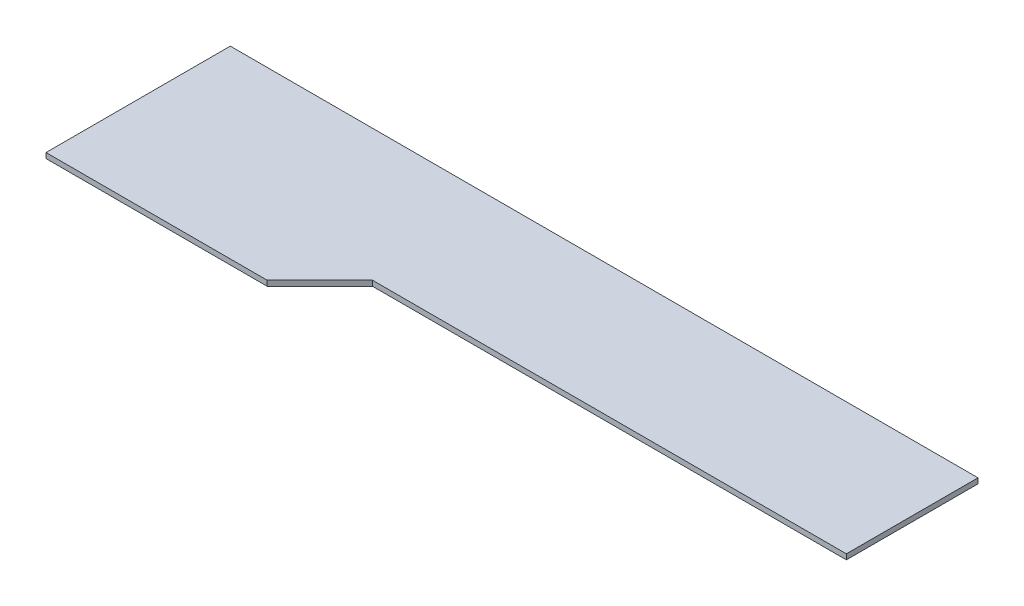
ISO-10303-21;
HEADER;
FILE_DESCRIPTION(('STEP AP214'),'2;1');
FILE_NAME('part.step','',(''),(''),'','','');
FILE_SCHEMA(('AUTOMOTIVE_DESIGN { 1 0 10303 214 1 1 1 1 }'));
ENDSEC;
DATA;
#1=APPLICATION_CONTEXT('core data for automotive mechanical design processes');
#2=APPLICATION_PROTOCOL_DEFINITION('international standard','automotive_design',2000,#1);
#3=PRODUCT_CONTEXT('',#1,'mechanical');
#4=PRODUCT('Part','Part','',(#3));
#5=PRODUCT_RELATED_PRODUCT_CATEGORY('part','',(#4));
#6=PRODUCT_DEFINITION_FORMATION('','',#4);
#7=PRODUCT_DEFINITION_CONTEXT('part definition',#1,'design');
#8=PRODUCT_DEFINITION('design','',#6,#7);
#9=PRODUCT_DEFINITION_SHAPE('','',#8);
#10=(LENGTH_UNIT() NAMED_UNIT(*) SI_UNIT(.MILLI.,.METRE.));
#11=(NAMED_UNIT(*) PLANE_ANGLE_UNIT() SI_UNIT($,.RADIAN.));
#12=(NAMED_UNIT(*) SI_UNIT($,.STERADIAN.) SOLID_ANGLE_UNIT());
#13=UNCERTAINTY_MEASURE_WITH_UNIT(LENGTH_MEASURE(1.E-05),#10,'distance_accuracy_value','');
#14=(GEOMETRIC_REPRESENTATION_CONTEXT(3) GLOBAL_UNCERTAINTY_ASSIGNED_CONTEXT((#13)) GLOBAL_UNIT_ASSIGNED_CONTEXT((#10,
#11,#12)) REPRESENTATION_CONTEXT('',''));
#15=CARTESIAN_POINT('',(0.,0.,0.));
#16=DIRECTION('',(0.,0.,1.));
#17=DIRECTION('',(1.,0.,0.));
#18=AXIS2_PLACEMENT_3D('',#15,#16,#17);
#19=CARTESIAN_POINT('',(0.,10.,100.));
#20=DIRECTION('',(0.,0.,-1.));
#21=DIRECTION('',(-1.,0.,0.));
#22=AXIS2_PLACEMENT_3D('',#19,#20,#21);
#23=PLANE('',#22);
#24=DIRECTION('',(1.,0.,0.));
#25=VECTOR('',#24,1.);
#26=CARTESIAN_POINT('',(0.,0.,100.));
#27=LINE('',#26,#25);
#28=CARTESIAN_POINT('',(0.,0.,100.));
#29=VERTEX_POINT('',#28);
#30=CARTESIAN_POINT('',(420.,0.,100.));
#31=VERTEX_POINT('',#30);
#32=EDGE_CURVE('E123',#29,#31,#27,.T.);
#33=ORIENTED_EDGE('',*,*,#32,.T.);
#34=DIRECTION('',(0.,-1.,0.));
#35=VECTOR('',#34,1.);
#36=CARTESIAN_POINT('',(420.,10.,100.));
#37=LINE('',#36,#35);
#38=CARTESIAN_POINT('',(420.,10.,100.));
#39=VERTEX_POINT('',#38);
#40=EDGE_CURVE('E43',#39,#31,#37,.T.);
#41=ORIENTED_EDGE('',*,*,#40,.F.);
#42=DIRECTION('',(1.,0.,0.));
#43=VECTOR('',#42,1.);
#44=CARTESIAN_POINT('',(0.,10.,100.));
#45=LINE('',#44,#43);
#46=CARTESIAN_POINT('',(0.,10.,100.));
#47=VERTEX_POINT('',#46);
#48=EDGE_CURVE('E89',#47,#39,#45,.T.);
#49=ORIENTED_EDGE('',*,*,#48,.F.);
#50=DIRECTION('',(0.,-1.,0.));
#51=VECTOR('',#50,1.);
#52=CARTESIAN_POINT('',(0.,10.,100.));
#53=LINE('',#52,#51);
#54=EDGE_CURVE('E11',#47,#29,#53,.T.);
#55=ORIENTED_EDGE('',*,*,#54,.T.);
#56=EDGE_LOOP('',(#33,#41,#49,#55));
#57=FACE_BOUND('',#56,.T.);
#58=ADVANCED_FACE('F35',(#57),#23,.F.);
#59=CARTESIAN_POINT('',(420.,10.,100.));
#60=DIRECTION('',(-0.707106781186549,0.,-0.707106781186546));
#61=DIRECTION('',(-0.707106781186546,0.,0.707106781186549));
#62=AXIS2_PLACEMENT_3D('',#59,#60,#61);
#63=PLANE('',#62);
#64=DIRECTION('',(0.707106781186546,0.,-0.707106781186549));
#65=VECTOR('',#64,1.);
#66=CARTESIAN_POINT('',(420.,0.,100.));
#67=LINE('',#66,#65);
#68=CARTESIAN_POINT('',(520.,0.,0.));
#69=VERTEX_POINT('',#68);
#70=EDGE_CURVE('E125',#31,#69,#67,.T.);
#71=ORIENTED_EDGE('',*,*,#70,.T.);
#72=DIRECTION('',(0.,-1.,0.));
#73=VECTOR('',#72,1.);
#74=CARTESIAN_POINT('',(520.,10.,0.));
#75=LINE('',#74,#73);
#76=CARTESIAN_POINT('',(520.,10.,0.));
#77=VERTEX_POINT('',#76);
#78=EDGE_CURVE('E112',#77,#69,#75,.T.);
#79=ORIENTED_EDGE('',*,*,#78,.F.);
#80=DIRECTION('',(0.707106781186546,0.,-0.707106781186549));
#81=VECTOR('',#80,1.);
#82=CARTESIAN_POINT('',(420.,10.,100.));
#83=LINE('',#82,#81);
#84=EDGE_CURVE('E103',#39,#77,#83,.T.);
#85=ORIENTED_EDGE('',*,*,#84,.F.);
#86=ORIENTED_EDGE('',*,*,#40,.T.);
#87=EDGE_LOOP('',(#71,#79,#85,#86));
#88=FACE_BOUND('',#87,.T.);
#89=ADVANCED_FACE('F137',(#88),#63,.F.);
#90=CARTESIAN_POINT('',(520.,10.,0.));
#91=DIRECTION('',(0.,0.,-1.));
#92=DIRECTION('',(-1.,0.,0.));
#93=AXIS2_PLACEMENT_3D('',#90,#91,#92);
#94=PLANE('',#93);
#95=DIRECTION('',(1.,0.,0.));
#96=VECTOR('',#95,1.);
#97=CARTESIAN_POINT('',(520.,0.,0.));
#98=LINE('',#97,#96);
#99=CARTESIAN_POINT('',(1420.,0.,0.));
#100=VERTEX_POINT('',#99);
#101=EDGE_CURVE('E111',#69,#100,#98,.T.);
#102=ORIENTED_EDGE('',*,*,#101,.T.);
#103=DIRECTION('',(0.,-1.,0.));
#104=VECTOR('',#103,1.);
#105=CARTESIAN_POINT('',(1420.,10.,0.));
#106=LINE('',#105,#104);
#107=CARTESIAN_POINT('',(1420.,10.,0.));
#108=VERTEX_POINT('',#107);
#109=EDGE_CURVE('E108',#108,#100,#106,.T.);
#110=ORIENTED_EDGE('',*,*,#109,.F.);
#111=DIRECTION('',(1.,0.,0.));
#112=VECTOR('',#111,1.);
#113=CARTESIAN_POINT('',(520.,10.,0.));
#114=LINE('',#113,#112);
#115=EDGE_CURVE('E97',#77,#108,#114,.T.);
#116=ORIENTED_EDGE('',*,*,#115,.F.);
#117=ORIENTED_EDGE('',*,*,#78,.T.);
#118=EDGE_LOOP('',(#102,#110,#116,#117));
#119=FACE_BOUND('',#118,.T.);
#120=ADVANCED_FACE('F109',(#119),#94,.F.);
#121=CARTESIAN_POINT('',(1420.,10.,0.));
#122=DIRECTION('',(-1.,0.,0.));
#123=DIRECTION('',(0.,0.,1.));
#124=AXIS2_PLACEMENT_3D('',#121,#122,#123);
#125=PLANE('',#124);
#126=DIRECTION('',(0.,0.,-1.));
#127=VECTOR('',#126,1.);
#128=CARTESIAN_POINT('',(1420.,0.,0.));
#129=LINE('',#128,#127);
#130=CARTESIAN_POINT('',(1420.,0.,-250.));
#131=VERTEX_POINT('',#130);
#132=EDGE_CURVE('E75',#100,#131,#129,.T.);
#133=ORIENTED_EDGE('',*,*,#132,.T.);
#134=DIRECTION('',(0.,-1.,0.));
#135=VECTOR('',#134,1.);
#136=CARTESIAN_POINT('',(1420.,10.,-250.));
#137=LINE('',#136,#135);
#138=CARTESIAN_POINT('',(1420.,10.,-250.));
#139=VERTEX_POINT('',#138);
#140=EDGE_CURVE('E113',#139,#131,#137,.T.);
#141=ORIENTED_EDGE('',*,*,#140,.F.);
#142=DIRECTION('',(0.,0.,-1.));
#143=VECTOR('',#142,1.);
#144=CARTESIAN_POINT('',(1420.,10.,0.));
#145=LINE('',#144,#143);
#146=EDGE_CURVE('E101',#108,#139,#145,.T.);
#147=ORIENTED_EDGE('',*,*,#146,.F.);
#148=ORIENTED_EDGE('',*,*,#109,.T.);
#149=EDGE_LOOP('',(#133,#141,#147,#148));
#150=FACE_BOUND('',#149,.T.);
#151=ADVANCED_FACE('F115',(#150),#125,.F.);
#152=CARTESIAN_POINT('',(0.,10.,-250.));
#153=DIRECTION('',(0.,0.,1.));
#154=DIRECTION('',(1.,0.,0.));
#155=AXIS2_PLACEMENT_3D('',#152,#153,#154);
#156=PLANE('',#155);
#157=DIRECTION('',(-1.,0.,0.));
#158=VECTOR('',#157,1.);
#159=CARTESIAN_POINT('',(0.,0.,-250.));
#160=LINE('',#159,#158);
#161=CARTESIAN_POINT('',(0.,0.,-250.));
#162=VERTEX_POINT('',#161);
#163=EDGE_CURVE('E82',#131,#162,#160,.T.);
#164=ORIENTED_EDGE('',*,*,#163,.T.);
#165=DIRECTION('',(0.,-1.,0.));
#166=VECTOR('',#165,1.);
#167=CARTESIAN_POINT('',(0.,10.,-250.));
#168=LINE('',#167,#166);
#169=CARTESIAN_POINT('',(0.,10.,-250.));
#170=VERTEX_POINT('',#169);
#171=EDGE_CURVE('E119',#170,#162,#168,.T.);
#172=ORIENTED_EDGE('',*,*,#171,.F.);
#173=DIRECTION('',(-1.,0.,0.));
#174=VECTOR('',#173,1.);
#175=CARTESIAN_POINT('',(0.,10.,-250.));
#176=LINE('',#175,#174);
#177=EDGE_CURVE('E117',#139,#170,#176,.T.);
#178=ORIENTED_EDGE('',*,*,#177,.F.);
#179=ORIENTED_EDGE('',*,*,#140,.T.);
#180=EDGE_LOOP('',(#164,#172,#178,#179));
#181=FACE_BOUND('',#180,.T.);
#182=ADVANCED_FACE('F143',(#181),#156,.F.);
#183=CARTESIAN_POINT('',(0.,10.,0.));
#184=DIRECTION('',(1.,0.,0.));
#185=DIRECTION('',(0.,0.,-1.));
#186=AXIS2_PLACEMENT_3D('',#183,#184,#185);
#187=PLANE('',#186);
#188=DIRECTION('',(0.,0.,1.));
#189=VECTOR('',#188,1.);
#190=CARTESIAN_POINT('',(0.,0.,0.));
#191=LINE('',#190,#189);
#192=EDGE_CURVE('E130',#162,#29,#191,.T.);
#193=ORIENTED_EDGE('',*,*,#192,.T.);
#194=ORIENTED_EDGE('',*,*,#54,.F.);
#195=DIRECTION('',(0.,0.,1.));
#196=VECTOR('',#195,1.);
#197=CARTESIAN_POINT('',(0.,10.,0.));
#198=LINE('',#197,#196);
#199=EDGE_CURVE('E51',#170,#47,#198,.T.);
#200=ORIENTED_EDGE('',*,*,#199,.F.);
#201=ORIENTED_EDGE('',*,*,#171,.T.);
#202=EDGE_LOOP('',(#193,#194,#200,#201));
#203=FACE_BOUND('',#202,.T.);
#204=ADVANCED_FACE('F142',(#203),#187,.F.);
#205=CARTESIAN_POINT('',(0.,10.,0.));
#206=DIRECTION('',(0.,1.,0.));
#207=DIRECTION('',(0.,0.,1.));
#208=AXIS2_PLACEMENT_3D('',#205,#206,#207);
#209=PLANE('',#208);
#210=ORIENTED_EDGE('',*,*,#199,.T.);
#211=ORIENTED_EDGE('',*,*,#48,.T.);
#212=ORIENTED_EDGE('',*,*,#84,.T.);
#213=ORIENTED_EDGE('',*,*,#115,.T.);
#214=ORIENTED_EDGE('',*,*,#146,.T.);
#215=ORIENTED_EDGE('',*,*,#177,.T.);
#216=EDGE_LOOP('',(#210,#211,#212,#213,#214,#215));
#217=FACE_BOUND('',#216,.T.);
#218=ADVANCED_FACE('F99',(#217),#209,.T.);
#219=CARTESIAN_POINT('',(0.,0.,0.));
#220=DIRECTION('',(0.,1.,0.));
#221=DIRECTION('',(0.,0.,1.));
#222=AXIS2_PLACEMENT_3D('',#219,#220,#221);
#223=PLANE('',#222);
#224=ORIENTED_EDGE('',*,*,#32,.F.);
#225=ORIENTED_EDGE('',*,*,#192,.F.);
#226=ORIENTED_EDGE('',*,*,#163,.F.);
#227=ORIENTED_EDGE('',*,*,#132,.F.);
#228=ORIENTED_EDGE('',*,*,#101,.F.);
#229=ORIENTED_EDGE('',*,*,#70,.F.);
#230=EDGE_LOOP('',(#224,#225,#226,#227,#228,#229));
#231=FACE_BOUND('',#230,.T.);
#232=ADVANCED_FACE('F140',(#231),#223,.F.);
#233=CLOSED_SHELL('',(#58,#89,#120,#151,#182,#204,#218,#232));
#234=MANIFOLD_SOLID_BREP('B2',#233);
#235=ADVANCED_BREP_SHAPE_REPRESENTATION('',(#18,#234),#14);
#236=SHAPE_DEFINITION_REPRESENTATION(#9,#235);
ENDSEC;
END-ISO-10303-21;
